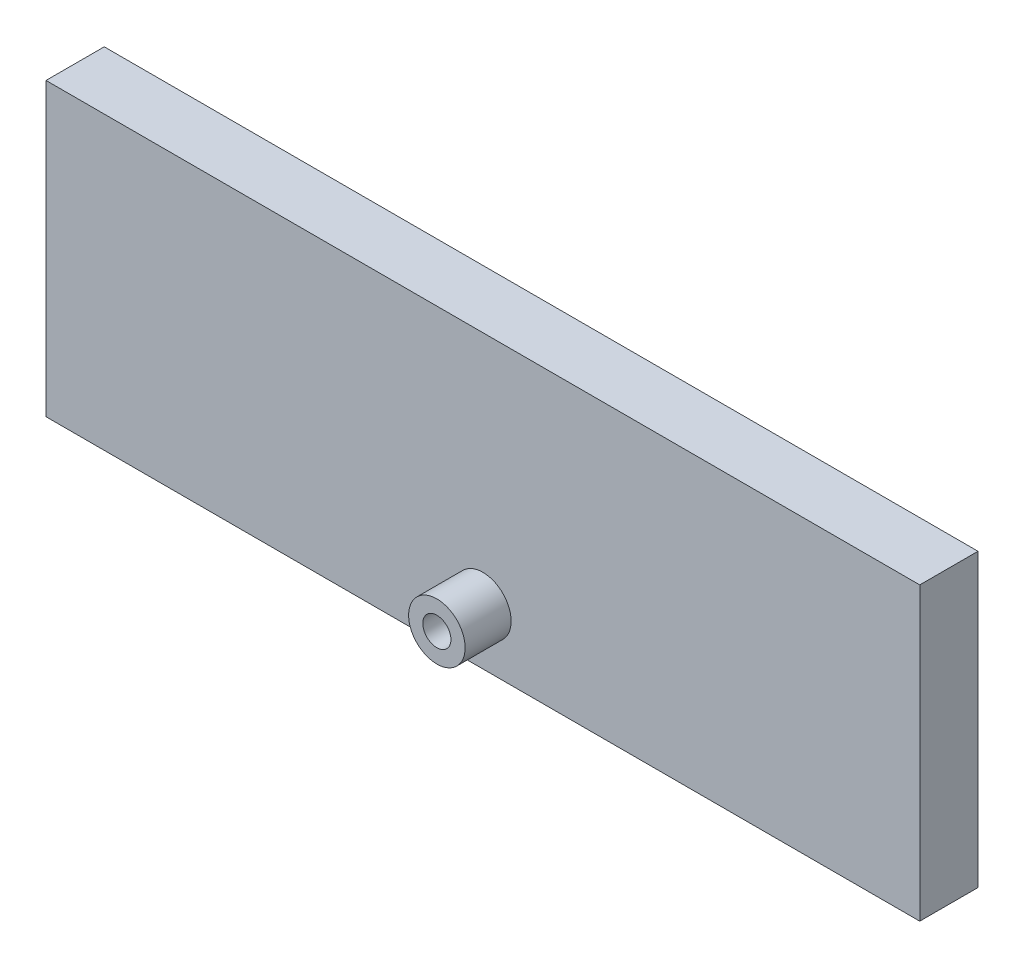
ISO-10303-21;
HEADER;
FILE_DESCRIPTION(('STEP AP214'),'2;1');
FILE_NAME('part.step','',(''),(''),'','','');
FILE_SCHEMA(('AUTOMOTIVE_DESIGN { 1 0 10303 214 1 1 1 1 }'));
ENDSEC;
DATA;
#1=APPLICATION_CONTEXT('core data for automotive mechanical design processes');
#2=APPLICATION_PROTOCOL_DEFINITION('international standard','automotive_design',2000,#1);
#3=PRODUCT_CONTEXT('',#1,'mechanical');
#4=PRODUCT('Part','Part','',(#3));
#5=PRODUCT_RELATED_PRODUCT_CATEGORY('part','',(#4));
#6=PRODUCT_DEFINITION_FORMATION('','',#4);
#7=PRODUCT_DEFINITION_CONTEXT('part definition',#1,'design');
#8=PRODUCT_DEFINITION('design','',#6,#7);
#9=PRODUCT_DEFINITION_SHAPE('','',#8);
#10=(LENGTH_UNIT() NAMED_UNIT(*) SI_UNIT(.MILLI.,.METRE.));
#11=(NAMED_UNIT(*) PLANE_ANGLE_UNIT() SI_UNIT($,.RADIAN.));
#12=(NAMED_UNIT(*) SI_UNIT($,.STERADIAN.) SOLID_ANGLE_UNIT());
#13=UNCERTAINTY_MEASURE_WITH_UNIT(LENGTH_MEASURE(1.E-05),#10,'distance_accuracy_value','');
#14=(GEOMETRIC_REPRESENTATION_CONTEXT(3) GLOBAL_UNCERTAINTY_ASSIGNED_CONTEXT((#13)) GLOBAL_UNIT_ASSIGNED_CONTEXT((#10,
#11,#12)) REPRESENTATION_CONTEXT('',''));
#15=CARTESIAN_POINT('',(0.,0.,0.));
#16=DIRECTION('',(0.,0.,1.));
#17=DIRECTION('',(1.,0.,0.));
#18=AXIS2_PLACEMENT_3D('',#15,#16,#17);
#19=CARTESIAN_POINT('',(150.,50.,20.));
#20=DIRECTION('',(-1.,0.,0.));
#21=DIRECTION('',(0.,0.,1.));
#22=AXIS2_PLACEMENT_3D('',#19,#20,#21);
#23=PLANE('',#22);
#24=DIRECTION('',(0.,1.,0.));
#25=VECTOR('',#24,1.);
#26=CARTESIAN_POINT('',(150.,50.,0.));
#27=LINE('',#26,#25);
#28=CARTESIAN_POINT('',(150.,-50.,0.));
#29=VERTEX_POINT('',#28);
#30=CARTESIAN_POINT('',(150.,50.,0.));
#31=VERTEX_POINT('',#30);
#32=EDGE_CURVE('E99',#29,#31,#27,.T.);
#33=ORIENTED_EDGE('',*,*,#32,.T.);
#34=DIRECTION('',(0.,0.,-1.));
#35=VECTOR('',#34,1.);
#36=CARTESIAN_POINT('',(150.,50.,20.));
#37=LINE('',#36,#35);
#38=CARTESIAN_POINT('',(150.,50.,20.));
#39=VERTEX_POINT('',#38);
#40=EDGE_CURVE('E41',#39,#31,#37,.T.);
#41=ORIENTED_EDGE('',*,*,#40,.F.);
#42=DIRECTION('',(0.,1.,0.));
#43=VECTOR('',#42,1.);
#44=CARTESIAN_POINT('',(150.,50.,20.));
#45=LINE('',#44,#43);
#46=CARTESIAN_POINT('',(150.,-50.,20.));
#47=VERTEX_POINT('',#46);
#48=EDGE_CURVE('E85',#47,#39,#45,.T.);
#49=ORIENTED_EDGE('',*,*,#48,.F.);
#50=DIRECTION('',(0.,0.,-1.));
#51=VECTOR('',#50,1.);
#52=CARTESIAN_POINT('',(150.,-50.,20.));
#53=LINE('',#52,#51);
#54=EDGE_CURVE('E95',#47,#29,#53,.T.);
#55=ORIENTED_EDGE('',*,*,#54,.T.);
#56=EDGE_LOOP('',(#33,#41,#49,#55));
#57=FACE_BOUND('',#56,.T.);
#58=ADVANCED_FACE('F33',(#57),#23,.F.);
#59=CARTESIAN_POINT('',(-150.,50.,20.));
#60=DIRECTION('',(0.,-1.,0.));
#61=DIRECTION('',(0.,0.,-1.));
#62=AXIS2_PLACEMENT_3D('',#59,#60,#61);
#63=PLANE('',#62);
#64=DIRECTION('',(-1.,0.,0.));
#65=VECTOR('',#64,1.);
#66=CARTESIAN_POINT('',(-150.,50.,0.));
#67=LINE('',#66,#65);
#68=CARTESIAN_POINT('',(-150.,50.,0.));
#69=VERTEX_POINT('',#68);
#70=EDGE_CURVE('E90',#31,#69,#67,.T.);
#71=ORIENTED_EDGE('',*,*,#70,.T.);
#72=DIRECTION('',(0.,0.,-1.));
#73=VECTOR('',#72,1.);
#74=CARTESIAN_POINT('',(-150.,50.,20.));
#75=LINE('',#74,#73);
#76=CARTESIAN_POINT('',(-150.,50.,20.));
#77=VERTEX_POINT('',#76);
#78=EDGE_CURVE('E88',#77,#69,#75,.T.);
#79=ORIENTED_EDGE('',*,*,#78,.F.);
#80=DIRECTION('',(-1.,0.,0.));
#81=VECTOR('',#80,1.);
#82=CARTESIAN_POINT('',(-150.,50.,20.));
#83=LINE('',#82,#81);
#84=EDGE_CURVE('E80',#39,#77,#83,.T.);
#85=ORIENTED_EDGE('',*,*,#84,.F.);
#86=ORIENTED_EDGE('',*,*,#40,.T.);
#87=EDGE_LOOP('',(#71,#79,#85,#86));
#88=FACE_BOUND('',#87,.T.);
#89=ADVANCED_FACE('F89',(#88),#63,.F.);
#90=CARTESIAN_POINT('',(-150.,50.,20.));
#91=DIRECTION('',(1.,0.,0.));
#92=DIRECTION('',(0.,0.,-1.));
#93=AXIS2_PLACEMENT_3D('',#90,#91,#92);
#94=PLANE('',#93);
#95=DIRECTION('',(0.,-1.,0.));
#96=VECTOR('',#95,1.);
#97=CARTESIAN_POINT('',(-150.,50.,0.));
#98=LINE('',#97,#96);
#99=CARTESIAN_POINT('',(-150.,-50.,0.));
#100=VERTEX_POINT('',#99);
#101=EDGE_CURVE('E66',#69,#100,#98,.T.);
#102=ORIENTED_EDGE('',*,*,#101,.T.);
#103=DIRECTION('',(0.,0.,-1.));
#104=VECTOR('',#103,1.);
#105=CARTESIAN_POINT('',(-150.,-50.,20.));
#106=LINE('',#105,#104);
#107=CARTESIAN_POINT('',(-150.,-50.,20.));
#108=VERTEX_POINT('',#107);
#109=EDGE_CURVE('E91',#108,#100,#106,.T.);
#110=ORIENTED_EDGE('',*,*,#109,.F.);
#111=DIRECTION('',(0.,-1.,0.));
#112=VECTOR('',#111,1.);
#113=CARTESIAN_POINT('',(-150.,50.,20.));
#114=LINE('',#113,#112);
#115=EDGE_CURVE('E83',#77,#108,#114,.T.);
#116=ORIENTED_EDGE('',*,*,#115,.F.);
#117=ORIENTED_EDGE('',*,*,#78,.T.);
#118=EDGE_LOOP('',(#102,#110,#116,#117));
#119=FACE_BOUND('',#118,.T.);
#120=ADVANCED_FACE('F93',(#119),#94,.F.);
#121=CARTESIAN_POINT('',(-150.,-50.,20.));
#122=DIRECTION('',(0.,1.,0.));
#123=DIRECTION('',(0.,0.,1.));
#124=AXIS2_PLACEMENT_3D('',#121,#122,#123);
#125=PLANE('',#124);
#126=DIRECTION('',(1.,0.,0.));
#127=VECTOR('',#126,1.);
#128=CARTESIAN_POINT('',(-150.,-50.,0.));
#129=LINE('',#128,#127);
#130=EDGE_CURVE('E72',#100,#29,#129,.T.);
#131=ORIENTED_EDGE('',*,*,#130,.T.);
#132=ORIENTED_EDGE('',*,*,#54,.F.);
#133=DIRECTION('',(1.,0.,0.));
#134=VECTOR('',#133,1.);
#135=CARTESIAN_POINT('',(-150.,-50.,20.));
#136=LINE('',#135,#134);
#137=EDGE_CURVE('E49',#108,#47,#136,.T.);
#138=ORIENTED_EDGE('',*,*,#137,.F.);
#139=ORIENTED_EDGE('',*,*,#109,.T.);
#140=EDGE_LOOP('',(#131,#132,#138,#139));
#141=FACE_BOUND('',#140,.T.);
#142=ADVANCED_FACE('F121',(#141),#125,.F.);
#143=CARTESIAN_POINT('',(0.,0.,20.));
#144=DIRECTION('',(0.,0.,1.));
#145=DIRECTION('',(1.,0.,0.));
#146=AXIS2_PLACEMENT_3D('',#143,#144,#145);
#147=PLANE('',#146);
#148=CARTESIAN_POINT('',(0.,-30.95,20.));
#149=DIRECTION('',(0.,0.,1.));
#150=DIRECTION('',(1.,0.,0.));
#151=AXIS2_PLACEMENT_3D('',#148,#149,#150);
#152=CIRCLE('',#151,9.7);
#153=CARTESIAN_POINT('',(9.7,-30.95,20.));
#154=VERTEX_POINT('',#153);
#155=EDGE_CURVE('E190',#154,#154,#152,.T.);
#156=ORIENTED_EDGE('',*,*,#155,.F.);
#157=EDGE_LOOP('',(#156));
#158=FACE_BOUND('',#157,.T.);
#159=ORIENTED_EDGE('',*,*,#48,.T.);
#160=ORIENTED_EDGE('',*,*,#84,.T.);
#161=ORIENTED_EDGE('',*,*,#115,.T.);
#162=ORIENTED_EDGE('',*,*,#137,.T.);
#163=EDGE_LOOP('',(#159,#160,#161,#162));
#164=FACE_BOUND('',#163,.T.);
#165=ADVANCED_FACE('F81',(#158,#164),#147,.T.);
#166=CARTESIAN_POINT('',(0.,0.,0.));
#167=DIRECTION('',(0.,0.,1.));
#168=DIRECTION('',(1.,0.,0.));
#169=AXIS2_PLACEMENT_3D('',#166,#167,#168);
#170=PLANE('',#169);
#171=ORIENTED_EDGE('',*,*,#32,.F.);
#172=ORIENTED_EDGE('',*,*,#130,.F.);
#173=ORIENTED_EDGE('',*,*,#101,.F.);
#174=ORIENTED_EDGE('',*,*,#70,.F.);
#175=EDGE_LOOP('',(#171,#172,#173,#174));
#176=FACE_BOUND('',#175,.T.);
#177=ADVANCED_FACE('F110',(#176),#170,.F.);
#178=CARTESIAN_POINT('',(0.,-30.95,35.8));
#179=DIRECTION('',(0.,0.,1.));
#180=DIRECTION('',(1.,0.,0.));
#181=AXIS2_PLACEMENT_3D('',#178,#179,#180);
#182=PLANE('',#181);
#183=CARTESIAN_POINT('',(0.,-30.95,35.8));
#184=DIRECTION('',(0.,0.,1.));
#185=DIRECTION('',(1.,0.,0.));
#186=AXIS2_PLACEMENT_3D('',#183,#184,#185);
#187=CIRCLE('',#186,9.7);
#188=CARTESIAN_POINT('',(9.7,-30.95,35.8));
#189=VERTEX_POINT('',#188);
#190=EDGE_CURVE('E102',#189,#189,#187,.T.);
#191=ORIENTED_EDGE('',*,*,#190,.T.);
#192=EDGE_LOOP('',(#191));
#193=FACE_BOUND('',#192,.T.);
#194=CARTESIAN_POINT('',(0.,-30.95,35.8));
#195=DIRECTION('',(0.,0.,1.));
#196=DIRECTION('',(1.,0.,0.));
#197=AXIS2_PLACEMENT_3D('',#194,#195,#196);
#198=CIRCLE('',#197,4.826);
#199=CARTESIAN_POINT('',(4.826,-30.95,35.8));
#200=VERTEX_POINT('',#199);
#201=EDGE_CURVE('E188',#200,#200,#198,.T.);
#202=ORIENTED_EDGE('',*,*,#201,.F.);
#203=EDGE_LOOP('',(#202));
#204=FACE_BOUND('',#203,.T.);
#205=ADVANCED_FACE('F112',(#193,#204),#182,.T.);
#206=CARTESIAN_POINT('',(0.,-30.95,35.8));
#207=DIRECTION('',(0.,0.,-1.));
#208=DIRECTION('',(-1.,0.,0.));
#209=AXIS2_PLACEMENT_3D('',#206,#207,#208);
#210=CYLINDRICAL_SURFACE('',#209,9.7);
#211=ORIENTED_EDGE('',*,*,#190,.F.);
#212=EDGE_LOOP('',(#211));
#213=FACE_BOUND('',#212,.T.);
#214=ORIENTED_EDGE('',*,*,#155,.T.);
#215=EDGE_LOOP('',(#214));
#216=FACE_BOUND('',#215,.T.);
#217=ADVANCED_FACE('F118',(#213,#216),#210,.T.);
#218=CARTESIAN_POINT('',(0.,-30.95,35.8));
#219=DIRECTION('',(0.,0.,-1.));
#220=DIRECTION('',(-1.,0.,0.));
#221=AXIS2_PLACEMENT_3D('',#218,#219,#220);
#222=CYLINDRICAL_SURFACE('',#221,4.826);
#223=ORIENTED_EDGE('',*,*,#201,.T.);
#224=EDGE_LOOP('',(#223));
#225=FACE_BOUND('',#224,.T.);
#226=CARTESIAN_POINT('',(0.,-30.95,20.));
#227=DIRECTION('',(0.,0.,1.));
#228=DIRECTION('',(1.,0.,0.));
#229=AXIS2_PLACEMENT_3D('',#226,#227,#228);
#230=CIRCLE('',#229,4.826);
#231=CARTESIAN_POINT('',(4.826,-30.95,20.));
#232=VERTEX_POINT('',#231);
#233=EDGE_CURVE('E11',#232,#232,#230,.F.);
#234=ORIENTED_EDGE('',*,*,#233,.T.);
#235=EDGE_LOOP('',(#234));
#236=FACE_BOUND('',#235,.T.);
#237=ADVANCED_FACE('F161',(#225,#236),#222,.F.);
#238=ORIENTED_EDGE('',*,*,#233,.F.);
#239=EDGE_LOOP('',(#238));
#240=FACE_BOUND('',#239,.T.);
#241=ADVANCED_FACE('F124',(#240),#147,.T.);
#242=CLOSED_SHELL('',(#58,#89,#120,#142,#165,#177,#205,#217,#237,#241));
#243=MANIFOLD_SOLID_BREP('B2',#242);
#244=ADVANCED_BREP_SHAPE_REPRESENTATION('',(#18,#243),#14);
#245=SHAPE_DEFINITION_REPRESENTATION(#9,#244);
ENDSEC;
END-ISO-10303-21;
